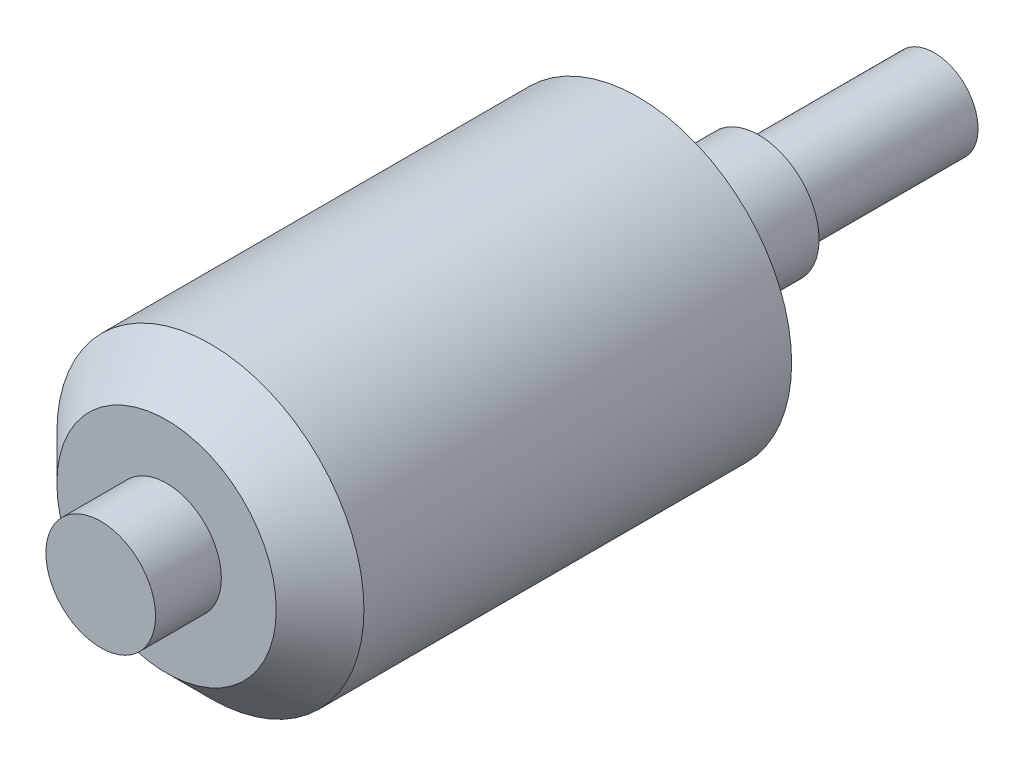
ISO-10303-21;
HEADER;
FILE_DESCRIPTION(('STEP AP214'),'2;1');
FILE_NAME('part.step','',(''),(''),'','','');
FILE_SCHEMA(('AUTOMOTIVE_DESIGN { 1 0 10303 214 1 1 1 1 }'));
ENDSEC;
DATA;
#1=APPLICATION_CONTEXT('core data for automotive mechanical design processes');
#2=APPLICATION_PROTOCOL_DEFINITION('international standard','automotive_design',2000,#1);
#3=PRODUCT_CONTEXT('',#1,'mechanical');
#4=PRODUCT('Part','Part','',(#3));
#5=PRODUCT_RELATED_PRODUCT_CATEGORY('part','',(#4));
#6=PRODUCT_DEFINITION_FORMATION('','',#4);
#7=PRODUCT_DEFINITION_CONTEXT('part definition',#1,'design');
#8=PRODUCT_DEFINITION('design','',#6,#7);
#9=PRODUCT_DEFINITION_SHAPE('','',#8);
#10=(LENGTH_UNIT() NAMED_UNIT(*) SI_UNIT(.MILLI.,.METRE.));
#11=(NAMED_UNIT(*) PLANE_ANGLE_UNIT() SI_UNIT($,.RADIAN.));
#12=(NAMED_UNIT(*) SI_UNIT($,.STERADIAN.) SOLID_ANGLE_UNIT());
#13=UNCERTAINTY_MEASURE_WITH_UNIT(LENGTH_MEASURE(1.E-05),#10,'distance_accuracy_value','');
#14=(GEOMETRIC_REPRESENTATION_CONTEXT(3) GLOBAL_UNCERTAINTY_ASSIGNED_CONTEXT((#13)) GLOBAL_UNIT_ASSIGNED_CONTEXT((#10,
#11,#12)) REPRESENTATION_CONTEXT('',''));
#15=CARTESIAN_POINT('',(0.,0.,0.));
#16=DIRECTION('',(0.,0.,1.));
#17=DIRECTION('',(1.,0.,0.));
#18=AXIS2_PLACEMENT_3D('',#15,#16,#17);
#19=CARTESIAN_POINT('',(0.,0.,43.));
#20=DIRECTION('',(0.,0.,-1.));
#21=DIRECTION('',(-1.,0.,0.));
#22=AXIS2_PLACEMENT_3D('',#19,#20,#21);
#23=CYLINDRICAL_SURFACE('',#22,14.);
#24=CARTESIAN_POINT('',(0.,0.,39.));
#25=DIRECTION('',(0.,0.,1.));
#26=DIRECTION('',(1.,0.,0.));
#27=AXIS2_PLACEMENT_3D('',#24,#25,#26);
#28=CIRCLE('',#27,14.);
#29=CARTESIAN_POINT('',(14.,0.,39.));
#30=VERTEX_POINT('',#29);
#31=EDGE_CURVE('E110',#30,#30,#28,.F.);
#32=ORIENTED_EDGE('',*,*,#31,.T.);
#33=EDGE_LOOP('',(#32));
#34=FACE_BOUND('',#33,.T.);
#35=CARTESIAN_POINT('',(0.,0.,0.));
#36=DIRECTION('',(0.,0.,1.));
#37=DIRECTION('',(1.,0.,0.));
#38=AXIS2_PLACEMENT_3D('',#35,#36,#37);
#39=CIRCLE('',#38,14.);
#40=CARTESIAN_POINT('',(14.,0.,0.));
#41=VERTEX_POINT('',#40);
#42=EDGE_CURVE('E106',#41,#41,#39,.T.);
#43=ORIENTED_EDGE('',*,*,#42,.T.);
#44=EDGE_LOOP('',(#43));
#45=FACE_BOUND('',#44,.T.);
#46=ADVANCED_FACE('F39',(#34,#45),#23,.T.);
#47=CARTESIAN_POINT('',(0.,0.,43.));
#48=DIRECTION('',(0.,0.,1.));
#49=DIRECTION('',(1.,0.,0.));
#50=AXIS2_PLACEMENT_3D('',#47,#48,#49);
#51=PLANE('',#50);
#52=CARTESIAN_POINT('',(0.,0.,43.));
#53=DIRECTION('',(0.,0.,1.));
#54=DIRECTION('',(1.,0.,0.));
#55=AXIS2_PLACEMENT_3D('',#52,#53,#54);
#56=CIRCLE('',#55,5.);
#57=CARTESIAN_POINT('',(5.,0.,43.));
#58=VERTEX_POINT('',#57);
#59=EDGE_CURVE('E54',#58,#58,#56,.T.);
#60=ORIENTED_EDGE('',*,*,#59,.F.);
#61=EDGE_LOOP('',(#60));
#62=FACE_BOUND('',#61,.T.);
#63=CARTESIAN_POINT('',(0.,0.,43.));
#64=DIRECTION('',(0.,0.,1.));
#65=DIRECTION('',(1.,0.,0.));
#66=AXIS2_PLACEMENT_3D('',#63,#64,#65);
#67=CIRCLE('',#66,9.99999999999997);
#68=CARTESIAN_POINT('',(9.99999999999997,0.,43.));
#69=VERTEX_POINT('',#68);
#70=EDGE_CURVE('E114',#69,#69,#67,.T.);
#71=ORIENTED_EDGE('',*,*,#70,.T.);
#72=EDGE_LOOP('',(#71));
#73=FACE_BOUND('',#72,.T.);
#74=ADVANCED_FACE('F129',(#62,#73),#51,.T.);
#75=CARTESIAN_POINT('',(0.,0.,0.));
#76=DIRECTION('',(0.,0.,1.));
#77=DIRECTION('',(1.,0.,0.));
#78=AXIS2_PLACEMENT_3D('',#75,#76,#77);
#79=PLANE('',#78);
#80=CARTESIAN_POINT('',(0.,0.,0.));
#81=DIRECTION('',(0.,0.,1.));
#82=DIRECTION('',(1.,0.,0.));
#83=AXIS2_PLACEMENT_3D('',#80,#81,#82);
#84=CIRCLE('',#83,2.52307460603174);
#85=CARTESIAN_POINT('',(2.52307460603174,0.,0.));
#86=VERTEX_POINT('',#85);
#87=EDGE_CURVE('E44',#86,#86,#84,.F.);
#88=ORIENTED_EDGE('',*,*,#87,.F.);
#89=EDGE_LOOP('',(#88));
#90=FACE_BOUND('',#89,.T.);
#91=CARTESIAN_POINT('',(0.,9.5,0.));
#92=DIRECTION('',(0.,0.,-1.));
#93=DIRECTION('',(-1.,0.,0.));
#94=AXIS2_PLACEMENT_3D('',#91,#92,#93);
#95=CIRCLE('',#94,1.25);
#96=CARTESIAN_POINT('',(-1.25,9.5,0.));
#97=VERTEX_POINT('',#96);
#98=EDGE_CURVE('E76',#97,#97,#95,.T.);
#99=ORIENTED_EDGE('',*,*,#98,.F.);
#100=EDGE_LOOP('',(#99));
#101=FACE_BOUND('',#100,.T.);
#102=CARTESIAN_POINT('',(-9.5,0.,0.));
#103=DIRECTION('',(0.,0.,-1.));
#104=DIRECTION('',(-1.,0.,0.));
#105=AXIS2_PLACEMENT_3D('',#102,#103,#104);
#106=CIRCLE('',#105,1.25);
#107=CARTESIAN_POINT('',(-10.75,0.,0.));
#108=VERTEX_POINT('',#107);
#109=EDGE_CURVE('E84',#108,#108,#106,.T.);
#110=ORIENTED_EDGE('',*,*,#109,.F.);
#111=EDGE_LOOP('',(#110));
#112=FACE_BOUND('',#111,.T.);
#113=CARTESIAN_POINT('',(0.,-9.5,0.));
#114=DIRECTION('',(0.,0.,-1.));
#115=DIRECTION('',(-1.,0.,0.));
#116=AXIS2_PLACEMENT_3D('',#113,#114,#115);
#117=CIRCLE('',#116,1.25);
#118=CARTESIAN_POINT('',(-1.25,-9.5,0.));
#119=VERTEX_POINT('',#118);
#120=EDGE_CURVE('E92',#119,#119,#117,.T.);
#121=ORIENTED_EDGE('',*,*,#120,.F.);
#122=EDGE_LOOP('',(#121));
#123=FACE_BOUND('',#122,.T.);
#124=CARTESIAN_POINT('',(9.5,0.,0.));
#125=DIRECTION('',(0.,0.,-1.));
#126=DIRECTION('',(-1.,0.,0.));
#127=AXIS2_PLACEMENT_3D('',#124,#125,#126);
#128=CIRCLE('',#127,1.25);
#129=CARTESIAN_POINT('',(8.25,0.,0.));
#130=VERTEX_POINT('',#129);
#131=EDGE_CURVE('E70',#130,#130,#128,.T.);
#132=ORIENTED_EDGE('',*,*,#131,.F.);
#133=EDGE_LOOP('',(#132));
#134=FACE_BOUND('',#133,.T.);
#135=ORIENTED_EDGE('',*,*,#42,.F.);
#136=EDGE_LOOP('',(#135));
#137=FACE_BOUND('',#136,.T.);
#138=ADVANCED_FACE('F126',(#90,#101,#112,#123,#134,#137),#79,.F.);
#139=CARTESIAN_POINT('',(0.,0.,43.));
#140=DIRECTION('',(0.,0.,-1.));
#141=DIRECTION('',(-1.,0.,0.));
#142=AXIS2_PLACEMENT_3D('',#139,#140,#141);
#143=CONICAL_SURFACE('',#142,9.99999999999997,0.785398163397447);
#144=ORIENTED_EDGE('',*,*,#31,.F.);
#145=EDGE_LOOP('',(#144));
#146=FACE_BOUND('',#145,.T.);
#147=ORIENTED_EDGE('',*,*,#70,.F.);
#148=EDGE_LOOP('',(#147));
#149=FACE_BOUND('',#148,.T.);
#150=ADVANCED_FACE('F42',(#146,#149),#143,.T.);
#151=CARTESIAN_POINT('',(0.,0.,49.));
#152=DIRECTION('',(0.,0.,-1.));
#153=DIRECTION('',(-1.,0.,0.));
#154=AXIS2_PLACEMENT_3D('',#151,#152,#153);
#155=CYLINDRICAL_SURFACE('',#154,5.);
#156=CARTESIAN_POINT('',(0.,0.,49.));
#157=DIRECTION('',(0.,0.,1.));
#158=DIRECTION('',(1.,0.,0.));
#159=AXIS2_PLACEMENT_3D('',#156,#157,#158);
#160=CIRCLE('',#159,5.);
#161=CARTESIAN_POINT('',(5.,0.,49.));
#162=VERTEX_POINT('',#161);
#163=EDGE_CURVE('E75',#162,#162,#160,.T.);
#164=ORIENTED_EDGE('',*,*,#163,.F.);
#165=EDGE_LOOP('',(#164));
#166=FACE_BOUND('',#165,.T.);
#167=ORIENTED_EDGE('',*,*,#59,.T.);
#168=EDGE_LOOP('',(#167));
#169=FACE_BOUND('',#168,.T.);
#170=ADVANCED_FACE('F125',(#166,#169),#155,.T.);
#171=CARTESIAN_POINT('',(0.,0.,49.));
#172=DIRECTION('',(0.,0.,1.));
#173=DIRECTION('',(1.,0.,0.));
#174=AXIS2_PLACEMENT_3D('',#171,#172,#173);
#175=PLANE('',#174);
#176=ORIENTED_EDGE('',*,*,#163,.T.);
#177=EDGE_LOOP('',(#176));
#178=FACE_BOUND('',#177,.T.);
#179=ADVANCED_FACE('F143',(#178),#175,.T.);
#180=CARTESIAN_POINT('',(9.5,0.,10.));
#181=DIRECTION('',(0.,0.,-1.));
#182=DIRECTION('',(-1.,0.,0.));
#183=AXIS2_PLACEMENT_3D('',#180,#181,#182);
#184=CYLINDRICAL_SURFACE('',#183,1.25);
#185=CARTESIAN_POINT('',(9.5,0.,10.));
#186=DIRECTION('',(0.,0.,-1.));
#187=DIRECTION('',(-1.,0.,0.));
#188=AXIS2_PLACEMENT_3D('',#185,#186,#187);
#189=CIRCLE('',#188,1.25);
#190=CARTESIAN_POINT('',(8.25,0.,10.));
#191=VERTEX_POINT('',#190);
#192=EDGE_CURVE('E96',#191,#191,#189,.T.);
#193=ORIENTED_EDGE('',*,*,#192,.F.);
#194=EDGE_LOOP('',(#193));
#195=FACE_BOUND('',#194,.T.);
#196=ORIENTED_EDGE('',*,*,#131,.T.);
#197=EDGE_LOOP('',(#196));
#198=FACE_BOUND('',#197,.T.);
#199=ADVANCED_FACE('F147',(#195,#198),#184,.F.);
#200=CARTESIAN_POINT('',(9.5,0.,10.));
#201=DIRECTION('',(0.,0.,-1.));
#202=DIRECTION('',(-1.,0.,0.));
#203=AXIS2_PLACEMENT_3D('',#200,#201,#202);
#204=PLANE('',#203);
#205=ORIENTED_EDGE('',*,*,#192,.T.);
#206=EDGE_LOOP('',(#205));
#207=FACE_BOUND('',#206,.T.);
#208=ADVANCED_FACE('F151',(#207),#204,.T.);
#209=CARTESIAN_POINT('',(0.,-9.5,10.));
#210=DIRECTION('',(0.,0.,-1.));
#211=DIRECTION('',(-1.,0.,0.));
#212=AXIS2_PLACEMENT_3D('',#209,#210,#211);
#213=CYLINDRICAL_SURFACE('',#212,1.25);
#214=CARTESIAN_POINT('',(0.,-9.5,10.));
#215=DIRECTION('',(0.,0.,-1.));
#216=DIRECTION('',(-1.,0.,0.));
#217=AXIS2_PLACEMENT_3D('',#214,#215,#216);
#218=CIRCLE('',#217,1.25);
#219=CARTESIAN_POINT('',(-1.25,-9.5,10.));
#220=VERTEX_POINT('',#219);
#221=EDGE_CURVE('E88',#220,#220,#218,.T.);
#222=ORIENTED_EDGE('',*,*,#221,.F.);
#223=EDGE_LOOP('',(#222));
#224=FACE_BOUND('',#223,.T.);
#225=ORIENTED_EDGE('',*,*,#120,.T.);
#226=EDGE_LOOP('',(#225));
#227=FACE_BOUND('',#226,.T.);
#228=ADVANCED_FACE('F155',(#224,#227),#213,.F.);
#229=CARTESIAN_POINT('',(0.,-9.5,10.));
#230=DIRECTION('',(0.,0.,-1.));
#231=DIRECTION('',(-1.,0.,0.));
#232=AXIS2_PLACEMENT_3D('',#229,#230,#231);
#233=PLANE('',#232);
#234=ORIENTED_EDGE('',*,*,#221,.T.);
#235=EDGE_LOOP('',(#234));
#236=FACE_BOUND('',#235,.T.);
#237=ADVANCED_FACE('F159',(#236),#233,.T.);
#238=CARTESIAN_POINT('',(-9.5,0.,10.));
#239=DIRECTION('',(0.,0.,-1.));
#240=DIRECTION('',(-1.,0.,0.));
#241=AXIS2_PLACEMENT_3D('',#238,#239,#240);
#242=CYLINDRICAL_SURFACE('',#241,1.25);
#243=CARTESIAN_POINT('',(-9.5,0.,10.));
#244=DIRECTION('',(0.,0.,-1.));
#245=DIRECTION('',(-1.,0.,0.));
#246=AXIS2_PLACEMENT_3D('',#243,#244,#245);
#247=CIRCLE('',#246,1.25);
#248=CARTESIAN_POINT('',(-10.75,0.,10.));
#249=VERTEX_POINT('',#248);
#250=EDGE_CURVE('E80',#249,#249,#247,.T.);
#251=ORIENTED_EDGE('',*,*,#250,.F.);
#252=EDGE_LOOP('',(#251));
#253=FACE_BOUND('',#252,.T.);
#254=ORIENTED_EDGE('',*,*,#109,.T.);
#255=EDGE_LOOP('',(#254));
#256=FACE_BOUND('',#255,.T.);
#257=ADVANCED_FACE('F163',(#253,#256),#242,.F.);
#258=CARTESIAN_POINT('',(-9.5,0.,10.));
#259=DIRECTION('',(0.,0.,-1.));
#260=DIRECTION('',(-1.,0.,0.));
#261=AXIS2_PLACEMENT_3D('',#258,#259,#260);
#262=PLANE('',#261);
#263=ORIENTED_EDGE('',*,*,#250,.T.);
#264=EDGE_LOOP('',(#263));
#265=FACE_BOUND('',#264,.T.);
#266=ADVANCED_FACE('F167',(#265),#262,.T.);
#267=CARTESIAN_POINT('',(0.,9.5,10.));
#268=DIRECTION('',(0.,0.,-1.));
#269=DIRECTION('',(-1.,0.,0.));
#270=AXIS2_PLACEMENT_3D('',#267,#268,#269);
#271=CYLINDRICAL_SURFACE('',#270,1.25);
#272=CARTESIAN_POINT('',(0.,9.5,10.));
#273=DIRECTION('',(0.,0.,-1.));
#274=DIRECTION('',(-1.,0.,0.));
#275=AXIS2_PLACEMENT_3D('',#272,#273,#274);
#276=CIRCLE('',#275,1.25);
#277=CARTESIAN_POINT('',(-1.25,9.5,10.));
#278=VERTEX_POINT('',#277);
#279=EDGE_CURVE('E71',#278,#278,#276,.T.);
#280=ORIENTED_EDGE('',*,*,#279,.F.);
#281=EDGE_LOOP('',(#280));
#282=FACE_BOUND('',#281,.T.);
#283=ORIENTED_EDGE('',*,*,#98,.T.);
#284=EDGE_LOOP('',(#283));
#285=FACE_BOUND('',#284,.T.);
#286=ADVANCED_FACE('F171',(#282,#285),#271,.F.);
#287=CARTESIAN_POINT('',(0.,9.5,10.));
#288=DIRECTION('',(0.,0.,-1.));
#289=DIRECTION('',(-1.,0.,0.));
#290=AXIS2_PLACEMENT_3D('',#287,#288,#289);
#291=PLANE('',#290);
#292=ORIENTED_EDGE('',*,*,#279,.T.);
#293=EDGE_LOOP('',(#292));
#294=FACE_BOUND('',#293,.T.);
#295=ADVANCED_FACE('F175',(#294),#291,.T.);
#296=CARTESIAN_POINT('',(0.,0.,-4.));
#297=DIRECTION('',(0.,0.,1.));
#298=DIRECTION('',(1.,0.,0.));
#299=AXIS2_PLACEMENT_3D('',#296,#297,#298);
#300=CYLINDRICAL_SURFACE('',#299,2.52307460603174);
#301=CARTESIAN_POINT('',(0.,0.,-4.));
#302=DIRECTION('',(0.,0.,-1.));
#303=DIRECTION('',(-1.,0.,0.));
#304=AXIS2_PLACEMENT_3D('',#301,#302,#303);
#305=CIRCLE('',#304,2.52307460603174);
#306=CARTESIAN_POINT('',(-2.52307460603174,0.,-4.));
#307=VERTEX_POINT('',#306);
#308=EDGE_CURVE('E62',#307,#307,#305,.T.);
#309=ORIENTED_EDGE('',*,*,#308,.F.);
#310=EDGE_LOOP('',(#309));
#311=FACE_BOUND('',#310,.T.);
#312=ORIENTED_EDGE('',*,*,#87,.T.);
#313=EDGE_LOOP('',(#312));
#314=FACE_BOUND('',#313,.T.);
#315=ADVANCED_FACE('F179',(#311,#314),#300,.T.);
#316=CARTESIAN_POINT('',(0.,0.,-11.));
#317=DIRECTION('',(0.,0.,1.));
#318=DIRECTION('',(1.,0.,0.));
#319=AXIS2_PLACEMENT_3D('',#316,#317,#318);
#320=CYLINDRICAL_SURFACE('',#319,5.5);
#321=CARTESIAN_POINT('',(0.,0.,-11.));
#322=DIRECTION('',(0.,0.,-1.));
#323=DIRECTION('',(-1.,0.,0.));
#324=AXIS2_PLACEMENT_3D('',#321,#322,#323);
#325=CIRCLE('',#324,5.5);
#326=CARTESIAN_POINT('',(-5.5,0.,-11.));
#327=VERTEX_POINT('',#326);
#328=EDGE_CURVE('E58',#327,#327,#325,.T.);
#329=ORIENTED_EDGE('',*,*,#328,.F.);
#330=EDGE_LOOP('',(#329));
#331=FACE_BOUND('',#330,.T.);
#332=CARTESIAN_POINT('',(0.,0.,-4.));
#333=DIRECTION('',(0.,0.,-1.));
#334=DIRECTION('',(-1.,0.,0.));
#335=AXIS2_PLACEMENT_3D('',#332,#333,#334);
#336=CIRCLE('',#335,5.5);
#337=CARTESIAN_POINT('',(-5.5,0.,-4.));
#338=VERTEX_POINT('',#337);
#339=EDGE_CURVE('E63',#338,#338,#336,.T.);
#340=ORIENTED_EDGE('',*,*,#339,.T.);
#341=EDGE_LOOP('',(#340));
#342=FACE_BOUND('',#341,.T.);
#343=ADVANCED_FACE('F183',(#331,#342),#320,.T.);
#344=CARTESIAN_POINT('',(0.,0.,-11.));
#345=DIRECTION('',(0.,0.,-1.));
#346=DIRECTION('',(-1.,0.,0.));
#347=AXIS2_PLACEMENT_3D('',#344,#345,#346);
#348=PLANE('',#347);
#349=CARTESIAN_POINT('',(0.,0.,-11.));
#350=DIRECTION('',(0.,0.,-1.));
#351=DIRECTION('',(-1.,0.,0.));
#352=AXIS2_PLACEMENT_3D('',#349,#350,#351);
#353=CIRCLE('',#352,4.);
#354=CARTESIAN_POINT('',(-4.,0.,-11.));
#355=VERTEX_POINT('',#354);
#356=EDGE_CURVE('E10',#355,#355,#353,.T.);
#357=ORIENTED_EDGE('',*,*,#356,.F.);
#358=EDGE_LOOP('',(#357));
#359=FACE_BOUND('',#358,.T.);
#360=ORIENTED_EDGE('',*,*,#328,.T.);
#361=EDGE_LOOP('',(#360));
#362=FACE_BOUND('',#361,.T.);
#363=ADVANCED_FACE('F187',(#359,#362),#348,.T.);
#364=CARTESIAN_POINT('',(0.,0.,-4.));
#365=DIRECTION('',(0.,0.,-1.));
#366=DIRECTION('',(-1.,0.,0.));
#367=AXIS2_PLACEMENT_3D('',#364,#365,#366);
#368=PLANE('',#367);
#369=ORIENTED_EDGE('',*,*,#308,.T.);
#370=EDGE_LOOP('',(#369));
#371=FACE_BOUND('',#370,.T.);
#372=ORIENTED_EDGE('',*,*,#339,.F.);
#373=EDGE_LOOP('',(#372));
#374=FACE_BOUND('',#373,.T.);
#375=ADVANCED_FACE('F189',(#371,#374),#368,.F.);
#376=CARTESIAN_POINT('',(0.,0.,-27.));
#377=DIRECTION('',(0.,0.,1.));
#378=DIRECTION('',(1.,0.,0.));
#379=AXIS2_PLACEMENT_3D('',#376,#377,#378);
#380=CYLINDRICAL_SURFACE('',#379,4.);
#381=CARTESIAN_POINT('',(0.,0.,-27.));
#382=DIRECTION('',(0.,0.,-1.));
#383=DIRECTION('',(-1.,0.,0.));
#384=AXIS2_PLACEMENT_3D('',#381,#382,#383);
#385=CIRCLE('',#384,4.);
#386=CARTESIAN_POINT('',(-4.,0.,-27.));
#387=VERTEX_POINT('',#386);
#388=EDGE_CURVE('E57',#387,#387,#385,.T.);
#389=ORIENTED_EDGE('',*,*,#388,.F.);
#390=EDGE_LOOP('',(#389));
#391=FACE_BOUND('',#390,.T.);
#392=ORIENTED_EDGE('',*,*,#356,.T.);
#393=EDGE_LOOP('',(#392));
#394=FACE_BOUND('',#393,.T.);
#395=ADVANCED_FACE('F192',(#391,#394),#380,.T.);
#396=CARTESIAN_POINT('',(0.,0.,-27.));
#397=DIRECTION('',(0.,0.,-1.));
#398=DIRECTION('',(-1.,0.,0.));
#399=AXIS2_PLACEMENT_3D('',#396,#397,#398);
#400=PLANE('',#399);
#401=ORIENTED_EDGE('',*,*,#388,.T.);
#402=EDGE_LOOP('',(#401));
#403=FACE_BOUND('',#402,.T.);
#404=ADVANCED_FACE('F199',(#403),#400,.T.);
#405=CLOSED_SHELL('',(#46,#74,#138,#150,#170,#179,#199,#208,#228,#237,#257,#266,#286,#295,#315,
#343,#363,#375,#395,#404));
#406=MANIFOLD_SOLID_BREP('B2',#405);
#407=ADVANCED_BREP_SHAPE_REPRESENTATION('',(#18,#406),#14);
#408=SHAPE_DEFINITION_REPRESENTATION(#9,#407);
ENDSEC;
END-ISO-10303-21;
